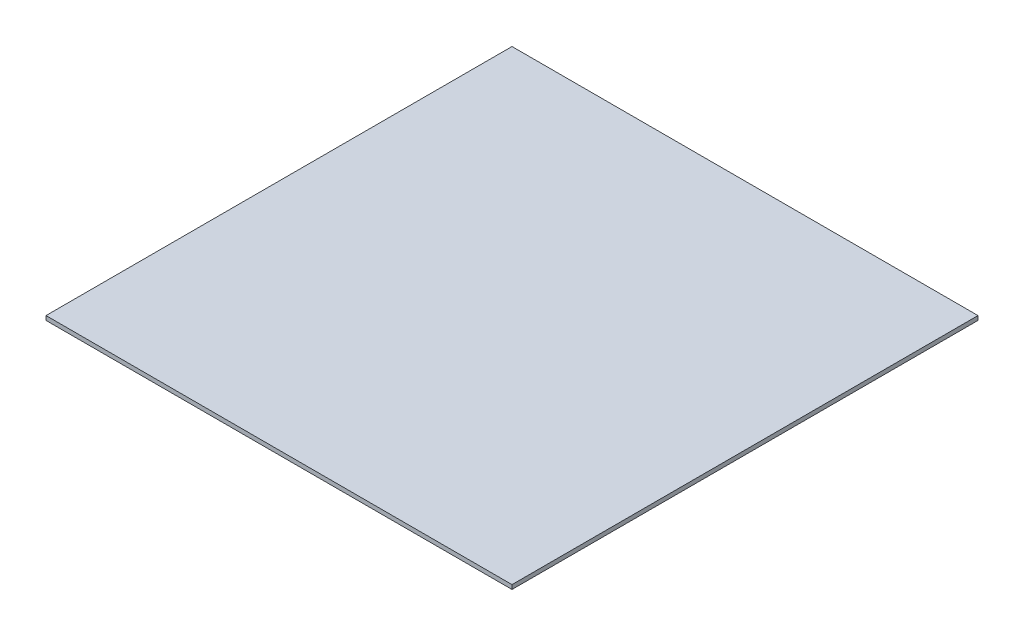
ISO-10303-21;
HEADER;
FILE_DESCRIPTION(('STEP AP214'),'2;1');
FILE_NAME('part.step','',(''),(''),'','','');
FILE_SCHEMA(('AUTOMOTIVE_DESIGN { 1 0 10303 214 1 1 1 1 }'));
ENDSEC;
DATA;
#1=APPLICATION_CONTEXT('core data for automotive mechanical design processes');
#2=APPLICATION_PROTOCOL_DEFINITION('international standard','automotive_design',2000,#1);
#3=PRODUCT_CONTEXT('',#1,'mechanical');
#4=PRODUCT('Part','Part','',(#3));
#5=PRODUCT_RELATED_PRODUCT_CATEGORY('part','',(#4));
#6=PRODUCT_DEFINITION_FORMATION('','',#4);
#7=PRODUCT_DEFINITION_CONTEXT('part definition',#1,'design');
#8=PRODUCT_DEFINITION('design','',#6,#7);
#9=PRODUCT_DEFINITION_SHAPE('','',#8);
#10=(LENGTH_UNIT() NAMED_UNIT(*) SI_UNIT(.MILLI.,.METRE.));
#11=(NAMED_UNIT(*) PLANE_ANGLE_UNIT() SI_UNIT($,.RADIAN.));
#12=(NAMED_UNIT(*) SI_UNIT($,.STERADIAN.) SOLID_ANGLE_UNIT());
#13=UNCERTAINTY_MEASURE_WITH_UNIT(LENGTH_MEASURE(1.E-05),#10,'distance_accuracy_value','');
#14=(GEOMETRIC_REPRESENTATION_CONTEXT(3) GLOBAL_UNCERTAINTY_ASSIGNED_CONTEXT((#13)) GLOBAL_UNIT_ASSIGNED_CONTEXT((#10,
#11,#12)) REPRESENTATION_CONTEXT('',''));
#15=CARTESIAN_POINT('',(0.,0.,0.));
#16=DIRECTION('',(0.,0.,1.));
#17=DIRECTION('',(1.,0.,0.));
#18=AXIS2_PLACEMENT_3D('',#15,#16,#17);
#19=CARTESIAN_POINT('',(139.7,2.54,139.7));
#20=DIRECTION('',(-1.,0.,0.));
#21=DIRECTION('',(0.,0.,1.));
#22=AXIS2_PLACEMENT_3D('',#19,#20,#21);
#23=PLANE('',#22);
#24=DIRECTION('',(0.,0.,-1.));
#25=VECTOR('',#24,1.);
#26=CARTESIAN_POINT('',(139.7,0.,139.7));
#27=LINE('',#26,#25);
#28=CARTESIAN_POINT('',(139.7,0.,139.7));
#29=VERTEX_POINT('',#28);
#30=CARTESIAN_POINT('',(139.7,0.,-139.7));
#31=VERTEX_POINT('',#30);
#32=EDGE_CURVE('E96',#29,#31,#27,.T.);
#33=ORIENTED_EDGE('',*,*,#32,.T.);
#34=DIRECTION('',(0.,-1.,0.));
#35=VECTOR('',#34,1.);
#36=CARTESIAN_POINT('',(139.7,2.54,-139.7));
#37=LINE('',#36,#35);
#38=CARTESIAN_POINT('',(139.7,2.54,-139.7));
#39=VERTEX_POINT('',#38);
#40=EDGE_CURVE('E11',#39,#31,#37,.T.);
#41=ORIENTED_EDGE('',*,*,#40,.F.);
#42=DIRECTION('',(0.,0.,-1.));
#43=VECTOR('',#42,1.);
#44=CARTESIAN_POINT('',(139.7,2.54,139.7));
#45=LINE('',#44,#43);
#46=CARTESIAN_POINT('',(139.7,2.54,139.7));
#47=VERTEX_POINT('',#46);
#48=EDGE_CURVE('E84',#47,#39,#45,.T.);
#49=ORIENTED_EDGE('',*,*,#48,.F.);
#50=DIRECTION('',(0.,-1.,0.));
#51=VECTOR('',#50,1.);
#52=CARTESIAN_POINT('',(139.7,2.54,139.7));
#53=LINE('',#52,#51);
#54=EDGE_CURVE('E92',#47,#29,#53,.T.);
#55=ORIENTED_EDGE('',*,*,#54,.T.);
#56=EDGE_LOOP('',(#33,#41,#49,#55));
#57=FACE_BOUND('',#56,.T.);
#58=ADVANCED_FACE('F33',(#57),#23,.F.);
#59=CARTESIAN_POINT('',(-139.7,2.54,-139.7));
#60=DIRECTION('',(0.,0.,1.));
#61=DIRECTION('',(1.,0.,0.));
#62=AXIS2_PLACEMENT_3D('',#59,#60,#61);
#63=PLANE('',#62);
#64=DIRECTION('',(-1.,0.,0.));
#65=VECTOR('',#64,1.);
#66=CARTESIAN_POINT('',(-139.7,0.,-139.7));
#67=LINE('',#66,#65);
#68=CARTESIAN_POINT('',(-139.7,0.,-139.7));
#69=VERTEX_POINT('',#68);
#70=EDGE_CURVE('E88',#31,#69,#67,.T.);
#71=ORIENTED_EDGE('',*,*,#70,.T.);
#72=DIRECTION('',(0.,-1.,0.));
#73=VECTOR('',#72,1.);
#74=CARTESIAN_POINT('',(-139.7,2.54,-139.7));
#75=LINE('',#74,#73);
#76=CARTESIAN_POINT('',(-139.7,2.54,-139.7));
#77=VERTEX_POINT('',#76);
#78=EDGE_CURVE('E41',#77,#69,#75,.T.);
#79=ORIENTED_EDGE('',*,*,#78,.F.);
#80=DIRECTION('',(-1.,0.,0.));
#81=VECTOR('',#80,1.);
#82=CARTESIAN_POINT('',(-139.7,2.54,-139.7));
#83=LINE('',#82,#81);
#84=EDGE_CURVE('E79',#39,#77,#83,.T.);
#85=ORIENTED_EDGE('',*,*,#84,.F.);
#86=ORIENTED_EDGE('',*,*,#40,.T.);
#87=EDGE_LOOP('',(#71,#79,#85,#86));
#88=FACE_BOUND('',#87,.T.);
#89=ADVANCED_FACE('F87',(#88),#63,.F.);
#90=CARTESIAN_POINT('',(-139.7,2.54,139.7));
#91=DIRECTION('',(1.,0.,0.));
#92=DIRECTION('',(0.,0.,-1.));
#93=AXIS2_PLACEMENT_3D('',#90,#91,#92);
#94=PLANE('',#93);
#95=DIRECTION('',(0.,0.,1.));
#96=VECTOR('',#95,1.);
#97=CARTESIAN_POINT('',(-139.7,0.,139.7));
#98=LINE('',#97,#96);
#99=CARTESIAN_POINT('',(-139.7,0.,139.7));
#100=VERTEX_POINT('',#99);
#101=EDGE_CURVE('E66',#69,#100,#98,.T.);
#102=ORIENTED_EDGE('',*,*,#101,.T.);
#103=DIRECTION('',(0.,-1.,0.));
#104=VECTOR('',#103,1.);
#105=CARTESIAN_POINT('',(-139.7,2.54,139.7));
#106=LINE('',#105,#104);
#107=CARTESIAN_POINT('',(-139.7,2.54,139.7));
#108=VERTEX_POINT('',#107);
#109=EDGE_CURVE('E89',#108,#100,#106,.T.);
#110=ORIENTED_EDGE('',*,*,#109,.F.);
#111=DIRECTION('',(0.,0.,1.));
#112=VECTOR('',#111,1.);
#113=CARTESIAN_POINT('',(-139.7,2.54,139.7));
#114=LINE('',#113,#112);
#115=EDGE_CURVE('E82',#77,#108,#114,.T.);
#116=ORIENTED_EDGE('',*,*,#115,.F.);
#117=ORIENTED_EDGE('',*,*,#78,.T.);
#118=EDGE_LOOP('',(#102,#110,#116,#117));
#119=FACE_BOUND('',#118,.T.);
#120=ADVANCED_FACE('F90',(#119),#94,.F.);
#121=CARTESIAN_POINT('',(-139.7,2.54,139.7));
#122=DIRECTION('',(0.,0.,-1.));
#123=DIRECTION('',(-1.,0.,0.));
#124=AXIS2_PLACEMENT_3D('',#121,#122,#123);
#125=PLANE('',#124);
#126=DIRECTION('',(1.,0.,0.));
#127=VECTOR('',#126,1.);
#128=CARTESIAN_POINT('',(-139.7,0.,139.7));
#129=LINE('',#128,#127);
#130=EDGE_CURVE('E72',#100,#29,#129,.T.);
#131=ORIENTED_EDGE('',*,*,#130,.T.);
#132=ORIENTED_EDGE('',*,*,#54,.F.);
#133=DIRECTION('',(1.,0.,0.));
#134=VECTOR('',#133,1.);
#135=CARTESIAN_POINT('',(-139.7,2.54,139.7));
#136=LINE('',#135,#134);
#137=EDGE_CURVE('E49',#108,#47,#136,.T.);
#138=ORIENTED_EDGE('',*,*,#137,.F.);
#139=ORIENTED_EDGE('',*,*,#109,.T.);
#140=EDGE_LOOP('',(#131,#132,#138,#139));
#141=FACE_BOUND('',#140,.T.);
#142=ADVANCED_FACE('F103',(#141),#125,.F.);
#143=CARTESIAN_POINT('',(0.,2.54,0.));
#144=DIRECTION('',(0.,-1.,0.));
#145=DIRECTION('',(0.,0.,-1.));
#146=AXIS2_PLACEMENT_3D('',#143,#144,#145);
#147=PLANE('',#146);
#148=ORIENTED_EDGE('',*,*,#48,.T.);
#149=ORIENTED_EDGE('',*,*,#84,.T.);
#150=ORIENTED_EDGE('',*,*,#115,.T.);
#151=ORIENTED_EDGE('',*,*,#137,.T.);
#152=EDGE_LOOP('',(#148,#149,#150,#151));
#153=FACE_BOUND('',#152,.T.);
#154=ADVANCED_FACE('F80',(#153),#147,.F.);
#155=CARTESIAN_POINT('',(0.,0.,0.));
#156=DIRECTION('',(0.,-1.,0.));
#157=DIRECTION('',(0.,0.,-1.));
#158=AXIS2_PLACEMENT_3D('',#155,#156,#157);
#159=PLANE('',#158);
#160=ORIENTED_EDGE('',*,*,#32,.F.);
#161=ORIENTED_EDGE('',*,*,#130,.F.);
#162=ORIENTED_EDGE('',*,*,#101,.F.);
#163=ORIENTED_EDGE('',*,*,#70,.F.);
#164=EDGE_LOOP('',(#160,#161,#162,#163));
#165=FACE_BOUND('',#164,.T.);
#166=ADVANCED_FACE('F106',(#165),#159,.T.);
#167=CLOSED_SHELL('',(#58,#89,#120,#142,#154,#166));
#168=MANIFOLD_SOLID_BREP('B2',#167);
#169=ADVANCED_BREP_SHAPE_REPRESENTATION('',(#18,#168),#14);
#170=SHAPE_DEFINITION_REPRESENTATION(#9,#169);
ENDSEC;
END-ISO-10303-21;
